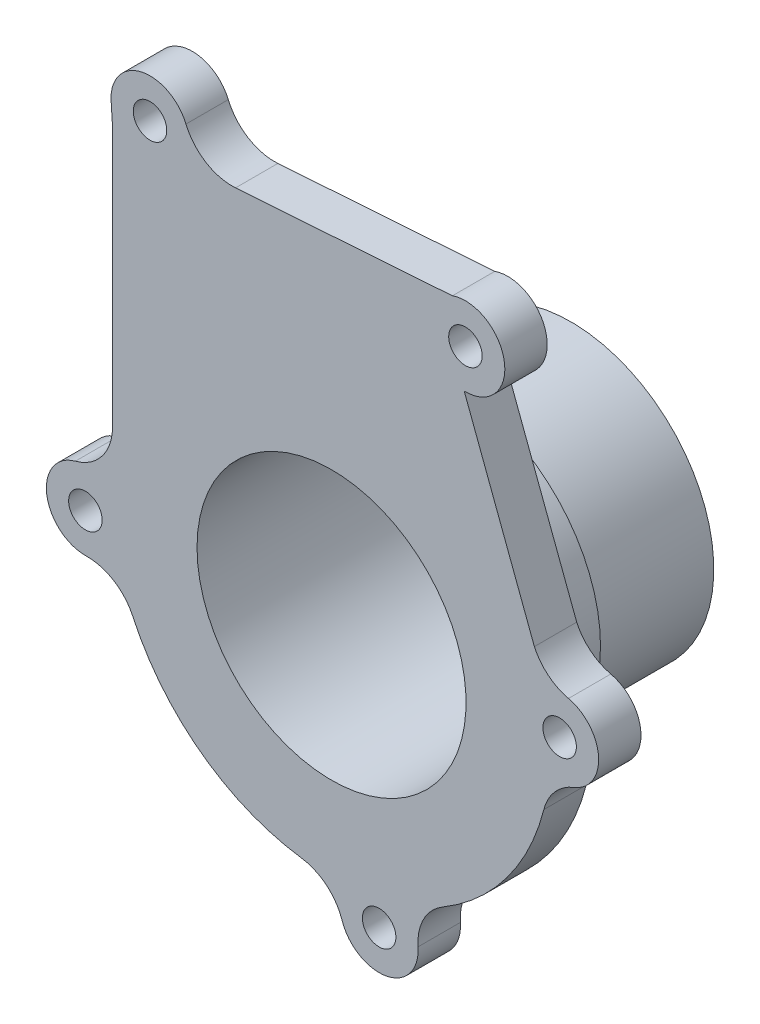
ISO-10303-21;
HEADER;
FILE_DESCRIPTION(('STEP AP214'),'2;1');
FILE_NAME('part.step','',(''),(''),'','','');
FILE_SCHEMA(('AUTOMOTIVE_DESIGN { 1 0 10303 214 1 1 1 1 }'));
ENDSEC;
DATA;
#1=APPLICATION_CONTEXT('core data for automotive mechanical design processes');
#2=APPLICATION_PROTOCOL_DEFINITION('international standard','automotive_design',2000,#1);
#3=PRODUCT_CONTEXT('',#1,'mechanical');
#4=PRODUCT('Part','Part','',(#3));
#5=PRODUCT_RELATED_PRODUCT_CATEGORY('part','',(#4));
#6=PRODUCT_DEFINITION_FORMATION('','',#4);
#7=PRODUCT_DEFINITION_CONTEXT('part definition',#1,'design');
#8=PRODUCT_DEFINITION('design','',#6,#7);
#9=PRODUCT_DEFINITION_SHAPE('','',#8);
#10=(LENGTH_UNIT() NAMED_UNIT(*) SI_UNIT(.MILLI.,.METRE.));
#11=(NAMED_UNIT(*) PLANE_ANGLE_UNIT() SI_UNIT($,.RADIAN.));
#12=(NAMED_UNIT(*) SI_UNIT($,.STERADIAN.) SOLID_ANGLE_UNIT());
#13=UNCERTAINTY_MEASURE_WITH_UNIT(LENGTH_MEASURE(1.E-05),#10,'distance_accuracy_value','');
#14=(GEOMETRIC_REPRESENTATION_CONTEXT(3) GLOBAL_UNCERTAINTY_ASSIGNED_CONTEXT((#13)) GLOBAL_UNIT_ASSIGNED_CONTEXT((#10,
#11,#12)) REPRESENTATION_CONTEXT('',''));
#15=CARTESIAN_POINT('',(0.,0.,0.));
#16=DIRECTION('',(0.,0.,1.));
#17=DIRECTION('',(1.,0.,0.));
#18=AXIS2_PLACEMENT_3D('',#15,#16,#17);
#19=CARTESIAN_POINT('',(52.8528625136495,-60.985277100375,-43.5));
#20=DIRECTION('',(0.,0.,-1.));
#21=DIRECTION('',(-1.,0.,0.));
#22=AXIS2_PLACEMENT_3D('',#19,#20,#21);
#23=PLANE('',#22);
#24=CARTESIAN_POINT('',(-42.3390203978951,65.23,-43.5));
#25=DIRECTION('',(0.,0.,-1.));
#26=DIRECTION('',(-1.,0.,0.));
#27=AXIS2_PLACEMENT_3D('',#24,#25,#26);
#28=CIRCLE('',#27,3.39999999999999);
#29=CARTESIAN_POINT('',(-45.7390203978951,65.23,-43.5));
#30=VERTEX_POINT('',#29);
#31=EDGE_CURVE('E670',#30,#30,#28,.F.);
#32=ORIENTED_EDGE('',*,*,#31,.F.);
#33=EDGE_LOOP('',(#32));
#34=FACE_BOUND('',#33,.T.);
#35=CARTESIAN_POINT('',(4.17391620101742,-53.35,-43.5));
#36=DIRECTION('',(0.,0.,-1.));
#37=DIRECTION('',(-1.,0.,0.));
#38=AXIS2_PLACEMENT_3D('',#35,#36,#37);
#39=CIRCLE('',#38,3.39999999999999);
#40=CARTESIAN_POINT('',(0.773916201017422,-53.35,-43.5));
#41=VERTEX_POINT('',#40);
#42=EDGE_CURVE('E337',#41,#41,#39,.F.);
#43=ORIENTED_EDGE('',*,*,#42,.F.);
#44=EDGE_LOOP('',(#43));
#45=FACE_BOUND('',#44,.T.);
#46=CARTESIAN_POINT('',(-55.4554330708661,-9.83324806785494,-43.5));
#47=DIRECTION('',(0.,0.,-1.));
#48=DIRECTION('',(-1.,0.,0.));
#49=AXIS2_PLACEMENT_3D('',#46,#47,#48);
#50=CIRCLE('',#49,7.92);
#51=CARTESIAN_POINT('',(-57.49,-2.17903763105122,-43.5));
#52=VERTEX_POINT('',#51);
#53=CARTESIAN_POINT('',(-55.28,-17.7513048520442,-43.5));
#54=VERTEX_POINT('',#53);
#55=EDGE_CURVE('E280',#52,#54,#50,.F.);
#56=ORIENTED_EDGE('',*,*,#55,.T.);
#57=CARTESIAN_POINT('',(-55.0547395718603,-27.9182867810235,-43.5));
#58=DIRECTION('',(0.,0.,-1.));
#59=DIRECTION('',(-1.,0.,0.));
#60=AXIS2_PLACEMENT_3D('',#57,#58,#59);
#61=CIRCLE('',#60,10.1694770664315);
#62=CARTESIAN_POINT('',(-45.8263926624487,-23.6455970983729,-43.5));
#63=VERTEX_POINT('',#62);
#64=EDGE_CURVE('E283',#54,#63,#61,.T.);
#65=ORIENTED_EDGE('',*,*,#64,.T.);
#66=CARTESIAN_POINT('',(-5.49,-4.97,-43.5));
#67=DIRECTION('',(0.,0.,-1.));
#68=DIRECTION('',(-1.,0.,0.));
#69=AXIS2_PLACEMENT_3D('',#66,#67,#68);
#70=CIRCLE('',#69,44.45);
#71=CARTESIAN_POINT('',(-11.5860314959817,-49.,-43.5));
#72=VERTEX_POINT('',#71);
#73=EDGE_CURVE('E288',#72,#63,#70,.T.);
#74=ORIENTED_EDGE('',*,*,#73,.F.);
#75=CARTESIAN_POINT('',(-12.9794101236346,-59.064,-43.5));
#76=DIRECTION('',(0.,0.,-1.));
#77=DIRECTION('',(-1.,0.,0.));
#78=AXIS2_PLACEMENT_3D('',#75,#76,#77);
#79=CIRCLE('',#78,10.16);
#80=CARTESIAN_POINT('',(-3.3401515252682,-55.8530353982301,-43.5));
#81=VERTEX_POINT('',#80);
#82=EDGE_CURVE('E367',#72,#81,#79,.T.);
#83=ORIENTED_EDGE('',*,*,#82,.T.);
#84=CARTESIAN_POINT('',(4.17391620101742,-53.35,-43.5));
#85=DIRECTION('',(0.,0.,-1.));
#86=DIRECTION('',(-1.,0.,0.));
#87=AXIS2_PLACEMENT_3D('',#84,#85,#86);
#88=CIRCLE('',#87,7.92);
#89=CARTESIAN_POINT('',(12.0729621051327,-52.774262382088,-43.5));
#90=VERTEX_POINT('',#89);
#91=EDGE_CURVE('E365',#81,#90,#88,.F.);
#92=ORIENTED_EDGE('',*,*,#91,.T.);
#93=CARTESIAN_POINT('',(22.2060815982908,-52.0356898823423,-43.5));
#94=DIRECTION('',(0.,0.,-1.));
#95=DIRECTION('',(-1.,0.,0.));
#96=AXIS2_PLACEMENT_3D('',#93,#94,#95);
#97=CIRCLE('',#96,10.16);
#98=CARTESIAN_POINT('',(17.0533222311669,-43.2792824623716,-43.5));
#99=VERTEX_POINT('',#98);
#100=EDGE_CURVE('E363',#90,#99,#97,.T.);
#101=ORIENTED_EDGE('',*,*,#100,.T.);
#102=CARTESIAN_POINT('',(-5.49,-4.97,-43.5));
#103=DIRECTION('',(0.,0.,-1.));
#104=DIRECTION('',(-1.,0.,0.));
#105=AXIS2_PLACEMENT_3D('',#102,#103,#104);
#106=CIRCLE('',#105,44.45);
#107=CARTESIAN_POINT('',(37.6,-15.8812052496504,-43.5));
#108=VERTEX_POINT('',#107);
#109=EDGE_CURVE('E360',#108,#99,#106,.T.);
#110=ORIENTED_EDGE('',*,*,#109,.F.);
#111=CARTESIAN_POINT('',(47.4491428571429,-18.3751950209991,-43.5));
#112=DIRECTION('',(0.,0.,-1.));
#113=DIRECTION('',(-1.,0.,0.));
#114=AXIS2_PLACEMENT_3D('',#111,#112,#113);
#115=CIRCLE('',#114,10.16);
#116=CARTESIAN_POINT('',(43.7182970922883,-8.92498920954368,-43.5));
#117=VERTEX_POINT('',#116);
#118=EDGE_CURVE('E357',#108,#117,#115,.T.);
#119=ORIENTED_EDGE('',*,*,#118,.T.);
#120=CARTESIAN_POINT('',(40.81,-1.55829334077133,-43.5));
#121=DIRECTION('',(0.,0.,-1.));
#122=DIRECTION('',(-1.,0.,0.));
#123=AXIS2_PLACEMENT_3D('',#120,#121,#122);
#124=CIRCLE('',#123,7.92);
#125=CARTESIAN_POINT('',(42.6070889527177,6.15512816307637,-43.5));
#126=VERTEX_POINT('',#125);
#127=EDGE_CURVE('E175',#117,#126,#124,.F.);
#128=ORIENTED_EDGE('',*,*,#127,.T.);
#129=CARTESIAN_POINT('',(44.9124454880221,16.0501234255881,-43.5));
#130=DIRECTION('',(0.,0.,-1.));
#131=DIRECTION('',(-1.,0.,0.));
#132=AXIS2_PLACEMENT_3D('',#129,#130,#131);
#133=CIRCLE('',#132,10.16);
#134=CARTESIAN_POINT('',(35.68,11.8089502022099,-43.5));
#135=VERTEX_POINT('',#134);
#136=EDGE_CURVE('E176',#126,#135,#133,.T.);
#137=ORIENTED_EDGE('',*,*,#136,.T.);
#138=DIRECTION('',(0.352509857178426,-0.935808100302645,0.));
#139=VECTOR('',#138,1.);
#140=CARTESIAN_POINT('',(35.141844193421,13.2375927004725,-43.5));
#141=LINE('',#140,#139);
#142=CARTESIAN_POINT('',(21.4389175955376,49.6147590321963,-43.5));
#143=VERTEX_POINT('',#142);
#144=EDGE_CURVE('E353',#143,#135,#141,.T.);
#145=ORIENTED_EDGE('',*,*,#144,.F.);
#146=CARTESIAN_POINT('',(21.6878075309389,57.6108864573976,-43.5));
#147=DIRECTION('',(0.,0.,-1.));
#148=DIRECTION('',(-1.,0.,0.));
#149=AXIS2_PLACEMENT_3D('',#146,#147,#148);
#150=CIRCLE('',#149,8.);
#151=CARTESIAN_POINT('',(19.04,65.16,-43.5));
#152=VERTEX_POINT('',#151);
#153=EDGE_CURVE('E350',#152,#143,#150,.T.);
#154=ORIENTED_EDGE('',*,*,#153,.F.);
#155=DIRECTION('',(-0.997623887237485,-0.0688954251976819,0.));
#156=VECTOR('',#155,1.);
#157=CARTESIAN_POINT('',(-4.38818412307743,63.5420608874567,-43.5));
#158=LINE('',#157,#156);
#159=CARTESIAN_POINT('',(-24.98,62.12,-43.5));
#160=VERTEX_POINT('',#159);
#161=EDGE_CURVE('E348',#152,#160,#158,.T.);
#162=ORIENTED_EDGE('',*,*,#161,.T.);
#163=CARTESIAN_POINT('',(-25.6799775200084,72.2558586943328,-43.5));
#164=DIRECTION('',(0.,0.,-1.));
#165=DIRECTION('',(-1.,0.,0.));
#166=AXIS2_PLACEMENT_3D('',#163,#164,#165);
#167=CIRCLE('',#166,10.16);
#168=CARTESIAN_POINT('',(-35.0414750664315,68.3076991625617,-43.5));
#169=VERTEX_POINT('',#168);
#170=EDGE_CURVE('E346',#160,#169,#167,.T.);
#171=ORIENTED_EDGE('',*,*,#170,.T.);
#172=CARTESIAN_POINT('',(-42.3390203978951,65.23,-43.5));
#173=DIRECTION('',(0.,0.,-1.));
#174=DIRECTION('',(-1.,0.,0.));
#175=AXIS2_PLACEMENT_3D('',#172,#173,#174);
#176=CIRCLE('',#175,7.92);
#177=CARTESIAN_POINT('',(-50.2590203978951,65.23,-43.5));
#178=VERTEX_POINT('',#177);
#179=EDGE_CURVE('E344',#169,#178,#176,.F.);
#180=ORIENTED_EDGE('',*,*,#179,.T.);
#181=DIRECTION('',(0.0645749609300092,-0.997912859131942,0.));
#182=VECTOR('',#181,1.);
#183=CARTESIAN_POINT('',(-45.8460108280122,-2.96669627104608,-43.5));
#184=LINE('',#183,#182);
#185=CARTESIAN_POINT('',(-49.94,60.3,-43.5));
#186=VERTEX_POINT('',#185);
#187=EDGE_CURVE('E55',#178,#186,#184,.T.);
#188=ORIENTED_EDGE('',*,*,#187,.T.);
#189=DIRECTION('',(0.,-1.,0.));
#190=VECTOR('',#189,1.);
#191=CARTESIAN_POINT('',(-49.94,0.,-43.5));
#192=LINE('',#191,#190);
#193=CARTESIAN_POINT('',(-49.94,7.63999999999999,-43.5));
#194=VERTEX_POINT('',#193);
#195=EDGE_CURVE('E165',#186,#194,#192,.T.);
#196=ORIENTED_EDGE('',*,*,#195,.T.);
#197=CARTESIAN_POINT('',(-60.1,7.63999999999999,-43.5));
#198=DIRECTION('',(0.,0.,-1.));
#199=DIRECTION('',(-1.,0.,0.));
#200=AXIS2_PLACEMENT_3D('',#197,#198,#199);
#201=CIRCLE('',#200,10.16);
#202=EDGE_CURVE('E167',#194,#52,#201,.T.);
#203=ORIENTED_EDGE('',*,*,#202,.T.);
#204=EDGE_LOOP('',(#56,#65,#74,#83,#92,#101,#110,#119,#128,#137,#145,#154,#162,#171,#180,#188,
#196,#203));
#205=FACE_BOUND('',#204,.T.);
#206=CARTESIAN_POINT('',(-5.49,-4.97,-43.5));
#207=DIRECTION('',(0.,0.,-1.));
#208=DIRECTION('',(-1.,0.,0.));
#209=AXIS2_PLACEMENT_3D('',#206,#207,#208);
#210=CIRCLE('',#209,27.305);
#211=CARTESIAN_POINT('',(-32.795,-4.97,-43.5));
#212=VERTEX_POINT('',#211);
#213=EDGE_CURVE('E171',#212,#212,#210,.F.);
#214=ORIENTED_EDGE('',*,*,#213,.F.);
#215=EDGE_LOOP('',(#214));
#216=FACE_BOUND('',#215,.T.);
#217=CARTESIAN_POINT('',(-55.4554330708661,-9.83324806785494,-43.5));
#218=DIRECTION('',(0.,0.,-1.));
#219=DIRECTION('',(-1.,0.,0.));
#220=AXIS2_PLACEMENT_3D('',#217,#218,#219);
#221=CIRCLE('',#220,3.39999999999999);
#222=CARTESIAN_POINT('',(-58.8554330708661,-9.83324806785494,-43.5));
#223=VERTEX_POINT('',#222);
#224=EDGE_CURVE('E332',#223,#223,#221,.F.);
#225=ORIENTED_EDGE('',*,*,#224,.F.);
#226=EDGE_LOOP('',(#225));
#227=FACE_BOUND('',#226,.T.);
#228=CARTESIAN_POINT('',(40.81,-1.55829334077133,-43.5));
#229=DIRECTION('',(0.,0.,-1.));
#230=DIRECTION('',(-1.,0.,0.));
#231=AXIS2_PLACEMENT_3D('',#228,#229,#230);
#232=CIRCLE('',#231,3.4);
#233=CARTESIAN_POINT('',(37.41,-1.55829334077133,-43.5));
#234=VERTEX_POINT('',#233);
#235=EDGE_CURVE('E321',#234,#234,#232,.F.);
#236=ORIENTED_EDGE('',*,*,#235,.F.);
#237=EDGE_LOOP('',(#236));
#238=FACE_BOUND('',#237,.T.);
#239=CARTESIAN_POINT('',(21.6878075309389,57.6108864573976,-43.5));
#240=DIRECTION('',(0.,0.,-1.));
#241=DIRECTION('',(-1.,0.,0.));
#242=AXIS2_PLACEMENT_3D('',#239,#240,#241);
#243=CIRCLE('',#242,3.39999999999999);
#244=CARTESIAN_POINT('',(18.2878075309389,57.6108864573976,-43.5));
#245=VERTEX_POINT('',#244);
#246=EDGE_CURVE('E322',#245,#245,#243,.F.);
#247=ORIENTED_EDGE('',*,*,#246,.F.);
#248=EDGE_LOOP('',(#247));
#249=FACE_BOUND('',#248,.T.);
#250=ADVANCED_FACE('F40',(#34,#45,#205,#216,#227,#238,#249),#23,.F.);
#251=CARTESIAN_POINT('',(52.8938965863105,-61.5794612709466,-52.0938183168574));
#252=DIRECTION('',(0.,0.,1.));
#253=DIRECTION('',(1.,0.,0.));
#254=AXIS2_PLACEMENT_3D('',#251,#252,#253);
#255=PLANE('',#254);
#256=CARTESIAN_POINT('',(-42.3390203978951,65.23,-52.0938183168574));
#257=DIRECTION('',(0.,0.,-1.));
#258=DIRECTION('',(-1.,0.,0.));
#259=AXIS2_PLACEMENT_3D('',#256,#257,#258);
#260=CIRCLE('',#259,3.39999999999999);
#261=CARTESIAN_POINT('',(-45.7390203978951,65.23,-52.0938183168574));
#262=VERTEX_POINT('',#261);
#263=EDGE_CURVE('E673',#262,#262,#260,.T.);
#264=ORIENTED_EDGE('',*,*,#263,.F.);
#265=EDGE_LOOP('',(#264));
#266=FACE_BOUND('',#265,.T.);
#267=CARTESIAN_POINT('',(21.6878075309389,57.6108864573976,-52.0938183168574));
#268=DIRECTION('',(0.,0.,-1.));
#269=DIRECTION('',(-1.,0.,0.));
#270=AXIS2_PLACEMENT_3D('',#267,#268,#269);
#271=CIRCLE('',#270,3.39999999999999);
#272=CARTESIAN_POINT('',(18.2878075309389,57.6108864573976,-52.0938183168574));
#273=VERTEX_POINT('',#272);
#274=EDGE_CURVE('E328',#273,#273,#271,.T.);
#275=ORIENTED_EDGE('',*,*,#274,.F.);
#276=EDGE_LOOP('',(#275));
#277=FACE_BOUND('',#276,.T.);
#278=CARTESIAN_POINT('',(-55.4554330708661,-9.83324806785494,-52.0938183168574));
#279=DIRECTION('',(0.,0.,-1.));
#280=DIRECTION('',(-1.,0.,0.));
#281=AXIS2_PLACEMENT_3D('',#278,#279,#280);
#282=CIRCLE('',#281,3.39999999999999);
#283=CARTESIAN_POINT('',(-58.8554330708661,-9.83324806785494,-52.0938183168574));
#284=VERTEX_POINT('',#283);
#285=EDGE_CURVE('E325',#284,#284,#282,.T.);
#286=ORIENTED_EDGE('',*,*,#285,.F.);
#287=EDGE_LOOP('',(#286));
#288=FACE_BOUND('',#287,.T.);
#289=CARTESIAN_POINT('',(-60.1,7.63999999999999,-52.0938183168574));
#290=DIRECTION('',(0.,0.,1.));
#291=DIRECTION('',(1.,0.,0.));
#292=AXIS2_PLACEMENT_3D('',#289,#290,#291);
#293=CIRCLE('',#292,10.16);
#294=CARTESIAN_POINT('',(-57.49,-2.17903763105123,-52.0938183168574));
#295=VERTEX_POINT('',#294);
#296=CARTESIAN_POINT('',(-49.94,7.63999999999999,-52.0938183168574));
#297=VERTEX_POINT('',#296);
#298=EDGE_CURVE('E181',#295,#297,#293,.T.);
#299=ORIENTED_EDGE('',*,*,#298,.T.);
#300=DIRECTION('',(0.,1.,0.));
#301=VECTOR('',#300,1.);
#302=CARTESIAN_POINT('',(-49.94,0.,-52.0938183168574));
#303=LINE('',#302,#301);
#304=CARTESIAN_POINT('',(-49.94,60.3,-52.0938183168574));
#305=VERTEX_POINT('',#304);
#306=EDGE_CURVE('E180',#297,#305,#303,.T.);
#307=ORIENTED_EDGE('',*,*,#306,.T.);
#308=DIRECTION('',(-0.0645749609300092,0.997912859131942,0.));
#309=VECTOR('',#308,1.);
#310=CARTESIAN_POINT('',(-45.8460108280122,-2.96669627104608,-52.0938183168574));
#311=LINE('',#310,#309);
#312=CARTESIAN_POINT('',(-50.2590203978951,65.23,-52.0938183168574));
#313=VERTEX_POINT('',#312);
#314=EDGE_CURVE('E224',#305,#313,#311,.T.);
#315=ORIENTED_EDGE('',*,*,#314,.T.);
#316=CARTESIAN_POINT('',(-42.3390203978951,65.23,-52.0938183168574));
#317=DIRECTION('',(0.,0.,1.));
#318=DIRECTION('',(1.,0.,0.));
#319=AXIS2_PLACEMENT_3D('',#316,#317,#318);
#320=CIRCLE('',#319,7.92);
#321=CARTESIAN_POINT('',(-35.0414750664315,68.3076991625617,-52.0938183168574));
#322=VERTEX_POINT('',#321);
#323=EDGE_CURVE('E231',#313,#322,#320,.F.);
#324=ORIENTED_EDGE('',*,*,#323,.T.);
#325=CARTESIAN_POINT('',(-25.6799775200084,72.2558586943328,-52.0938183168574));
#326=DIRECTION('',(0.,0.,1.));
#327=DIRECTION('',(1.,0.,0.));
#328=AXIS2_PLACEMENT_3D('',#325,#326,#327);
#329=CIRCLE('',#328,10.16);
#330=CARTESIAN_POINT('',(-24.98,62.12,-52.0938183168574));
#331=VERTEX_POINT('',#330);
#332=EDGE_CURVE('E233',#322,#331,#329,.T.);
#333=ORIENTED_EDGE('',*,*,#332,.T.);
#334=DIRECTION('',(0.997623887237485,0.0688954251976819,0.));
#335=VECTOR('',#334,1.);
#336=CARTESIAN_POINT('',(-4.38818412307743,63.5420608874567,-52.0938183168574));
#337=LINE('',#336,#335);
#338=CARTESIAN_POINT('',(19.04,65.16,-52.0938183168574));
#339=VERTEX_POINT('',#338);
#340=EDGE_CURVE('E239',#331,#339,#337,.T.);
#341=ORIENTED_EDGE('',*,*,#340,.T.);
#342=CARTESIAN_POINT('',(21.6878075309389,57.6108864573976,-52.0938183168574));
#343=DIRECTION('',(0.,0.,1.));
#344=DIRECTION('',(1.,0.,0.));
#345=AXIS2_PLACEMENT_3D('',#342,#343,#344);
#346=CIRCLE('',#345,8.);
#347=CARTESIAN_POINT('',(21.4389175955376,49.6147590321963,-52.0938183168574));
#348=VERTEX_POINT('',#347);
#349=EDGE_CURVE('E242',#348,#339,#346,.T.);
#350=ORIENTED_EDGE('',*,*,#349,.F.);
#351=DIRECTION('',(-0.352509857178426,0.935808100302645,0.));
#352=VECTOR('',#351,1.);
#353=CARTESIAN_POINT('',(35.141844193421,13.2375927004725,-52.0938183168574));
#354=LINE('',#353,#352);
#355=CARTESIAN_POINT('',(35.68,11.8089502022099,-52.0938183168574));
#356=VERTEX_POINT('',#355);
#357=EDGE_CURVE('E245',#356,#348,#354,.T.);
#358=ORIENTED_EDGE('',*,*,#357,.F.);
#359=CARTESIAN_POINT('',(44.9124454880221,16.0501234255881,-52.0938183168574));
#360=DIRECTION('',(0.,0.,1.));
#361=DIRECTION('',(1.,0.,0.));
#362=AXIS2_PLACEMENT_3D('',#359,#360,#361);
#363=CIRCLE('',#362,10.16);
#364=CARTESIAN_POINT('',(42.6070889527177,6.15512816307637,-52.0938183168574));
#365=VERTEX_POINT('',#364);
#366=EDGE_CURVE('E248',#356,#365,#363,.T.);
#367=ORIENTED_EDGE('',*,*,#366,.T.);
#368=CARTESIAN_POINT('',(40.81,-1.55829334077133,-52.0938183168574));
#369=DIRECTION('',(0.,0.,1.));
#370=DIRECTION('',(1.,0.,0.));
#371=AXIS2_PLACEMENT_3D('',#368,#369,#370);
#372=CIRCLE('',#371,7.92);
#373=CARTESIAN_POINT('',(43.7182970922883,-8.92498920954368,-52.0938183168574));
#374=VERTEX_POINT('',#373);
#375=EDGE_CURVE('E251',#365,#374,#372,.F.);
#376=ORIENTED_EDGE('',*,*,#375,.T.);
#377=CARTESIAN_POINT('',(47.4491428571429,-18.3751950209991,-52.0938183168574));
#378=DIRECTION('',(0.,0.,1.));
#379=DIRECTION('',(1.,0.,0.));
#380=AXIS2_PLACEMENT_3D('',#377,#378,#379);
#381=CIRCLE('',#380,10.16);
#382=CARTESIAN_POINT('',(37.6,-15.8812052496504,-52.0938183168574));
#383=VERTEX_POINT('',#382);
#384=EDGE_CURVE('E254',#374,#383,#381,.T.);
#385=ORIENTED_EDGE('',*,*,#384,.T.);
#386=CARTESIAN_POINT('',(-5.49,-4.97,-52.0938183168574));
#387=DIRECTION('',(0.,0.,1.));
#388=DIRECTION('',(1.,0.,0.));
#389=AXIS2_PLACEMENT_3D('',#386,#387,#388);
#390=CIRCLE('',#389,44.45);
#391=CARTESIAN_POINT('',(17.0533222311669,-43.2792824623716,-52.0938183168574));
#392=VERTEX_POINT('',#391);
#393=EDGE_CURVE('E257',#392,#383,#390,.T.);
#394=ORIENTED_EDGE('',*,*,#393,.F.);
#395=CARTESIAN_POINT('',(22.2060815982908,-52.0356898823423,-52.0938183168574));
#396=DIRECTION('',(0.,0.,1.));
#397=DIRECTION('',(1.,0.,0.));
#398=AXIS2_PLACEMENT_3D('',#395,#396,#397);
#399=CIRCLE('',#398,10.16);
#400=CARTESIAN_POINT('',(12.0729621051327,-52.774262382088,-52.0938183168574));
#401=VERTEX_POINT('',#400);
#402=EDGE_CURVE('E260',#392,#401,#399,.T.);
#403=ORIENTED_EDGE('',*,*,#402,.T.);
#404=CARTESIAN_POINT('',(4.17391620101742,-53.35,-52.0938183168574));
#405=DIRECTION('',(0.,0.,1.));
#406=DIRECTION('',(1.,0.,0.));
#407=AXIS2_PLACEMENT_3D('',#404,#405,#406);
#408=CIRCLE('',#407,7.92);
#409=CARTESIAN_POINT('',(-3.3401515252682,-55.8530353982301,-52.0938183168574));
#410=VERTEX_POINT('',#409);
#411=EDGE_CURVE('E263',#401,#410,#408,.F.);
#412=ORIENTED_EDGE('',*,*,#411,.T.);
#413=CARTESIAN_POINT('',(-12.9794101236346,-59.064,-52.0938183168574));
#414=DIRECTION('',(0.,0.,1.));
#415=DIRECTION('',(1.,0.,0.));
#416=AXIS2_PLACEMENT_3D('',#413,#414,#415);
#417=CIRCLE('',#416,10.16);
#418=CARTESIAN_POINT('',(-11.5860314959817,-49.,-52.0938183168574));
#419=VERTEX_POINT('',#418);
#420=EDGE_CURVE('E266',#410,#419,#417,.T.);
#421=ORIENTED_EDGE('',*,*,#420,.T.);
#422=CARTESIAN_POINT('',(-5.49,-4.97,-52.0938183168574));
#423=DIRECTION('',(0.,0.,1.));
#424=DIRECTION('',(1.,0.,0.));
#425=AXIS2_PLACEMENT_3D('',#422,#423,#424);
#426=CIRCLE('',#425,44.45);
#427=CARTESIAN_POINT('',(-45.8263926624487,-23.6455970983729,-52.0938183168574));
#428=VERTEX_POINT('',#427);
#429=EDGE_CURVE('E269',#428,#419,#426,.T.);
#430=ORIENTED_EDGE('',*,*,#429,.F.);
#431=CARTESIAN_POINT('',(-55.0547395718603,-27.9182867810235,-52.0938183168574));
#432=DIRECTION('',(0.,0.,1.));
#433=DIRECTION('',(1.,0.,0.));
#434=AXIS2_PLACEMENT_3D('',#431,#432,#433);
#435=CIRCLE('',#434,10.1694770664315);
#436=CARTESIAN_POINT('',(-55.28,-17.7513048520442,-52.0938183168574));
#437=VERTEX_POINT('',#436);
#438=EDGE_CURVE('E272',#428,#437,#435,.T.);
#439=ORIENTED_EDGE('',*,*,#438,.T.);
#440=CARTESIAN_POINT('',(-55.4554330708661,-9.83324806785494,-52.0938183168574));
#441=DIRECTION('',(0.,0.,1.));
#442=DIRECTION('',(1.,0.,0.));
#443=AXIS2_PLACEMENT_3D('',#440,#441,#442);
#444=CIRCLE('',#443,7.92);
#445=EDGE_CURVE('E185',#437,#295,#444,.F.);
#446=ORIENTED_EDGE('',*,*,#445,.T.);
#447=EDGE_LOOP('',(#299,#307,#315,#324,#333,#341,#350,#358,#367,#376,#385,#394,#403,#412,#421,
#430,#439,#446));
#448=FACE_BOUND('',#447,.T.);
#449=CARTESIAN_POINT('',(-5.49,-4.97,-52.0938183168574));
#450=DIRECTION('',(0.,0.,1.));
#451=DIRECTION('',(1.,0.,0.));
#452=AXIS2_PLACEMENT_3D('',#449,#450,#451);
#453=CIRCLE('',#452,31.);
#454=CARTESIAN_POINT('',(25.51,-4.97,-52.0938183168574));
#455=VERTEX_POINT('',#454);
#456=EDGE_CURVE('E11',#455,#455,#453,.F.);
#457=ORIENTED_EDGE('',*,*,#456,.F.);
#458=EDGE_LOOP('',(#457));
#459=FACE_BOUND('',#458,.T.);
#460=CARTESIAN_POINT('',(4.17391620101742,-53.35,-52.0938183168574));
#461=DIRECTION('',(0.,0.,-1.));
#462=DIRECTION('',(-1.,0.,0.));
#463=AXIS2_PLACEMENT_3D('',#460,#461,#462);
#464=CIRCLE('',#463,3.39999999999999);
#465=CARTESIAN_POINT('',(0.773916201017426,-53.35,-52.0938183168574));
#466=VERTEX_POINT('',#465);
#467=EDGE_CURVE('E316',#466,#466,#464,.T.);
#468=ORIENTED_EDGE('',*,*,#467,.F.);
#469=EDGE_LOOP('',(#468));
#470=FACE_BOUND('',#469,.T.);
#471=CARTESIAN_POINT('',(40.81,-1.55829334077133,-52.0938183168574));
#472=DIRECTION('',(0.,0.,-1.));
#473=DIRECTION('',(-1.,0.,0.));
#474=AXIS2_PLACEMENT_3D('',#471,#472,#473);
#475=CIRCLE('',#474,3.39999999999999);
#476=CARTESIAN_POINT('',(37.41,-1.55829334077133,-52.0938183168574));
#477=VERTEX_POINT('',#476);
#478=EDGE_CURVE('E319',#477,#477,#475,.T.);
#479=ORIENTED_EDGE('',*,*,#478,.F.);
#480=EDGE_LOOP('',(#479));
#481=FACE_BOUND('',#480,.T.);
#482=ADVANCED_FACE('F221',(#266,#277,#288,#448,#459,#470,#481),#255,.F.);
#483=CARTESIAN_POINT('',(-5.49,-4.97,-67.0938183168574));
#484=DIRECTION('',(0.,0.,-1.));
#485=DIRECTION('',(-1.,0.,0.));
#486=AXIS2_PLACEMENT_3D('',#483,#484,#485);
#487=PLANE('',#486);
#488=CARTESIAN_POINT('',(-5.49,-4.97,-67.0938183168574));
#489=DIRECTION('',(0.,0.,-1.));
#490=DIRECTION('',(-1.,0.,0.));
#491=AXIS2_PLACEMENT_3D('',#488,#489,#490);
#492=CIRCLE('',#491,31.);
#493=CARTESIAN_POINT('',(-36.49,-4.97,-67.0938183168574));
#494=VERTEX_POINT('',#493);
#495=EDGE_CURVE('E227',#494,#494,#492,.T.);
#496=ORIENTED_EDGE('',*,*,#495,.T.);
#497=EDGE_LOOP('',(#496));
#498=FACE_BOUND('',#497,.T.);
#499=CARTESIAN_POINT('',(-5.49,-4.97,-67.0938183168574));
#500=DIRECTION('',(0.,0.,-1.));
#501=DIRECTION('',(-1.,0.,0.));
#502=AXIS2_PLACEMENT_3D('',#499,#500,#501);
#503=CIRCLE('',#502,29.);
#504=CARTESIAN_POINT('',(-34.49,-4.97,-67.0938183168574));
#505=VERTEX_POINT('',#504);
#506=EDGE_CURVE('E286',#505,#505,#503,.T.);
#507=ORIENTED_EDGE('',*,*,#506,.F.);
#508=EDGE_LOOP('',(#507));
#509=FACE_BOUND('',#508,.T.);
#510=ADVANCED_FACE('F299',(#498,#509),#487,.T.);
#511=CARTESIAN_POINT('',(-60.1,7.63999999999999,-30.));
#512=DIRECTION('',(0.,0.,-1.));
#513=DIRECTION('',(1.,0.,0.));
#514=AXIS2_PLACEMENT_3D('',#511,#512,#513);
#515=CYLINDRICAL_SURFACE('',#514,10.16);
#516=ORIENTED_EDGE('',*,*,#202,.F.);
#517=DIRECTION('',(0.,0.,-1.));
#518=VECTOR('',#517,1.);
#519=CARTESIAN_POINT('',(-49.94,7.63999999999999,-30.));
#520=LINE('',#519,#518);
#521=EDGE_CURVE('E63',#194,#297,#520,.T.);
#522=ORIENTED_EDGE('',*,*,#521,.T.);
#523=ORIENTED_EDGE('',*,*,#298,.F.);
#524=DIRECTION('',(0.,0.,-1.));
#525=VECTOR('',#524,1.);
#526=CARTESIAN_POINT('',(-57.49,-2.17903763105122,-30.));
#527=LINE('',#526,#525);
#528=EDGE_CURVE('E174',#52,#295,#527,.T.);
#529=ORIENTED_EDGE('',*,*,#528,.F.);
#530=EDGE_LOOP('',(#516,#522,#523,#529));
#531=FACE_BOUND('',#530,.T.);
#532=ADVANCED_FACE('F173',(#531),#515,.F.);
#533=CARTESIAN_POINT('',(-55.4554330708661,-9.83324806785494,-30.));
#534=DIRECTION('',(0.,0.,-1.));
#535=DIRECTION('',(1.,0.,0.));
#536=AXIS2_PLACEMENT_3D('',#533,#534,#535);
#537=CYLINDRICAL_SURFACE('',#536,7.92);
#538=ORIENTED_EDGE('',*,*,#55,.F.);
#539=ORIENTED_EDGE('',*,*,#528,.T.);
#540=ORIENTED_EDGE('',*,*,#445,.F.);
#541=DIRECTION('',(0.,0.,-1.));
#542=VECTOR('',#541,1.);
#543=CARTESIAN_POINT('',(-55.28,-17.7513048520442,-30.));
#544=LINE('',#543,#542);
#545=EDGE_CURVE('E183',#54,#437,#544,.T.);
#546=ORIENTED_EDGE('',*,*,#545,.F.);
#547=EDGE_LOOP('',(#538,#539,#540,#546));
#548=FACE_BOUND('',#547,.T.);
#549=ADVANCED_FACE('F279',(#548),#537,.T.);
#550=CARTESIAN_POINT('',(-55.0547395718603,-27.9182867810235,-30.));
#551=DIRECTION('',(0.,0.,-1.));
#552=DIRECTION('',(1.,0.,0.));
#553=AXIS2_PLACEMENT_3D('',#550,#551,#552);
#554=CYLINDRICAL_SURFACE('',#553,10.1694770664315);
#555=ORIENTED_EDGE('',*,*,#64,.F.);
#556=ORIENTED_EDGE('',*,*,#545,.T.);
#557=ORIENTED_EDGE('',*,*,#438,.F.);
#558=DIRECTION('',(0.,0.,-1.));
#559=VECTOR('',#558,1.);
#560=CARTESIAN_POINT('',(-45.8263926624487,-23.6455970983729,-30.));
#561=LINE('',#560,#559);
#562=EDGE_CURVE('E190',#63,#428,#561,.T.);
#563=ORIENTED_EDGE('',*,*,#562,.F.);
#564=EDGE_LOOP('',(#555,#556,#557,#563));
#565=FACE_BOUND('',#564,.T.);
#566=ADVANCED_FACE('F375',(#565),#554,.F.);
#567=CARTESIAN_POINT('',(-5.49,-4.97,-30.));
#568=DIRECTION('',(0.,0.,-1.));
#569=DIRECTION('',(1.,0.,0.));
#570=AXIS2_PLACEMENT_3D('',#567,#568,#569);
#571=CYLINDRICAL_SURFACE('',#570,44.45);
#572=DIRECTION('',(0.,0.,-1.));
#573=VECTOR('',#572,1.);
#574=CARTESIAN_POINT('',(-11.5860314959817,-49.,-30.));
#575=LINE('',#574,#573);
#576=EDGE_CURVE('E192',#72,#419,#575,.T.);
#577=ORIENTED_EDGE('',*,*,#576,.F.);
#578=ORIENTED_EDGE('',*,*,#73,.T.);
#579=ORIENTED_EDGE('',*,*,#562,.T.);
#580=ORIENTED_EDGE('',*,*,#429,.T.);
#581=EDGE_LOOP('',(#577,#578,#579,#580));
#582=FACE_BOUND('',#581,.T.);
#583=ADVANCED_FACE('F372',(#582),#571,.T.);
#584=CARTESIAN_POINT('',(-12.9794101236346,-59.064,-30.));
#585=DIRECTION('',(0.,0.,-1.));
#586=DIRECTION('',(1.,0.,0.));
#587=AXIS2_PLACEMENT_3D('',#584,#585,#586);
#588=CYLINDRICAL_SURFACE('',#587,10.16);
#589=ORIENTED_EDGE('',*,*,#82,.F.);
#590=ORIENTED_EDGE('',*,*,#576,.T.);
#591=ORIENTED_EDGE('',*,*,#420,.F.);
#592=DIRECTION('',(0.,0.,-1.));
#593=VECTOR('',#592,1.);
#594=CARTESIAN_POINT('',(-3.3401515252682,-55.8530353982301,-30.));
#595=LINE('',#594,#593);
#596=EDGE_CURVE('E194',#81,#410,#595,.T.);
#597=ORIENTED_EDGE('',*,*,#596,.F.);
#598=EDGE_LOOP('',(#589,#590,#591,#597));
#599=FACE_BOUND('',#598,.T.);
#600=ADVANCED_FACE('F382',(#599),#588,.F.);
#601=CARTESIAN_POINT('',(4.17391620101742,-53.35,-30.));
#602=DIRECTION('',(0.,0.,-1.));
#603=DIRECTION('',(1.,0.,0.));
#604=AXIS2_PLACEMENT_3D('',#601,#602,#603);
#605=CYLINDRICAL_SURFACE('',#604,7.92);
#606=ORIENTED_EDGE('',*,*,#91,.F.);
#607=ORIENTED_EDGE('',*,*,#596,.T.);
#608=ORIENTED_EDGE('',*,*,#411,.F.);
#609=DIRECTION('',(0.,0.,-1.));
#610=VECTOR('',#609,1.);
#611=CARTESIAN_POINT('',(12.0729621051327,-52.774262382088,-30.));
#612=LINE('',#611,#610);
#613=EDGE_CURVE('E196',#90,#401,#612,.T.);
#614=ORIENTED_EDGE('',*,*,#613,.F.);
#615=EDGE_LOOP('',(#606,#607,#608,#614));
#616=FACE_BOUND('',#615,.T.);
#617=ADVANCED_FACE('F437',(#616),#605,.T.);
#618=CARTESIAN_POINT('',(22.2060815982908,-52.0356898823423,-30.));
#619=DIRECTION('',(0.,0.,-1.));
#620=DIRECTION('',(1.,0.,0.));
#621=AXIS2_PLACEMENT_3D('',#618,#619,#620);
#622=CYLINDRICAL_SURFACE('',#621,10.16);
#623=ORIENTED_EDGE('',*,*,#100,.F.);
#624=ORIENTED_EDGE('',*,*,#613,.T.);
#625=ORIENTED_EDGE('',*,*,#402,.F.);
#626=DIRECTION('',(0.,0.,-1.));
#627=VECTOR('',#626,1.);
#628=CARTESIAN_POINT('',(17.0533222311669,-43.2792824623716,-30.));
#629=LINE('',#628,#627);
#630=EDGE_CURVE('E198',#99,#392,#629,.T.);
#631=ORIENTED_EDGE('',*,*,#630,.F.);
#632=EDGE_LOOP('',(#623,#624,#625,#631));
#633=FACE_BOUND('',#632,.T.);
#634=ADVANCED_FACE('F447',(#633),#622,.F.);
#635=CARTESIAN_POINT('',(-5.49,-4.97,-30.));
#636=DIRECTION('',(0.,0.,-1.));
#637=DIRECTION('',(1.,0.,0.));
#638=AXIS2_PLACEMENT_3D('',#635,#636,#637);
#639=CYLINDRICAL_SURFACE('',#638,44.45);
#640=DIRECTION('',(0.,0.,-1.));
#641=VECTOR('',#640,1.);
#642=CARTESIAN_POINT('',(37.6,-15.8812052496504,-30.));
#643=LINE('',#642,#641);
#644=EDGE_CURVE('E200',#108,#383,#643,.T.);
#645=ORIENTED_EDGE('',*,*,#644,.F.);
#646=ORIENTED_EDGE('',*,*,#109,.T.);
#647=ORIENTED_EDGE('',*,*,#630,.T.);
#648=ORIENTED_EDGE('',*,*,#393,.T.);
#649=EDGE_LOOP('',(#645,#646,#647,#648));
#650=FACE_BOUND('',#649,.T.);
#651=ADVANCED_FACE('F457',(#650),#639,.T.);
#652=CARTESIAN_POINT('',(47.4491428571429,-18.3751950209991,-30.));
#653=DIRECTION('',(0.,0.,-1.));
#654=DIRECTION('',(1.,0.,0.));
#655=AXIS2_PLACEMENT_3D('',#652,#653,#654);
#656=CYLINDRICAL_SURFACE('',#655,10.16);
#657=ORIENTED_EDGE('',*,*,#118,.F.);
#658=ORIENTED_EDGE('',*,*,#644,.T.);
#659=ORIENTED_EDGE('',*,*,#384,.F.);
#660=DIRECTION('',(0.,0.,-1.));
#661=VECTOR('',#660,1.);
#662=CARTESIAN_POINT('',(43.7182970922883,-8.92498920954368,-30.));
#663=LINE('',#662,#661);
#664=EDGE_CURVE('E202',#117,#374,#663,.T.);
#665=ORIENTED_EDGE('',*,*,#664,.F.);
#666=EDGE_LOOP('',(#657,#658,#659,#665));
#667=FACE_BOUND('',#666,.T.);
#668=ADVANCED_FACE('F468',(#667),#656,.F.);
#669=CARTESIAN_POINT('',(40.81,-1.55829334077133,-30.));
#670=DIRECTION('',(0.,0.,-1.));
#671=DIRECTION('',(1.,0.,0.));
#672=AXIS2_PLACEMENT_3D('',#669,#670,#671);
#673=CYLINDRICAL_SURFACE('',#672,7.92);
#674=DIRECTION('',(0.,0.,-1.));
#675=VECTOR('',#674,1.);
#676=CARTESIAN_POINT('',(42.6070889527177,6.15512816307637,-30.));
#677=LINE('',#676,#675);
#678=EDGE_CURVE('E204',#126,#365,#677,.T.);
#679=ORIENTED_EDGE('',*,*,#678,.F.);
#680=ORIENTED_EDGE('',*,*,#127,.F.);
#681=ORIENTED_EDGE('',*,*,#664,.T.);
#682=ORIENTED_EDGE('',*,*,#375,.F.);
#683=EDGE_LOOP('',(#679,#680,#681,#682));
#684=FACE_BOUND('',#683,.T.);
#685=ADVANCED_FACE('F478',(#684),#673,.T.);
#686=CARTESIAN_POINT('',(44.9124454880221,16.0501234255881,-30.));
#687=DIRECTION('',(0.,0.,-1.));
#688=DIRECTION('',(1.,0.,0.));
#689=AXIS2_PLACEMENT_3D('',#686,#687,#688);
#690=CYLINDRICAL_SURFACE('',#689,10.16);
#691=ORIENTED_EDGE('',*,*,#136,.F.);
#692=ORIENTED_EDGE('',*,*,#678,.T.);
#693=ORIENTED_EDGE('',*,*,#366,.F.);
#694=DIRECTION('',(0.,0.,-1.));
#695=VECTOR('',#694,1.);
#696=CARTESIAN_POINT('',(35.68,11.8089502022099,-30.));
#697=LINE('',#696,#695);
#698=EDGE_CURVE('E206',#135,#356,#697,.T.);
#699=ORIENTED_EDGE('',*,*,#698,.F.);
#700=EDGE_LOOP('',(#691,#692,#693,#699));
#701=FACE_BOUND('',#700,.T.);
#702=ADVANCED_FACE('F488',(#701),#690,.F.);
#703=CARTESIAN_POINT('',(35.141844193421,13.2375927004725,-30.));
#704=DIRECTION('',(-0.935808100302645,-0.352509857178426,0.));
#705=DIRECTION('',(0.352509857178426,-0.935808100302645,0.));
#706=AXIS2_PLACEMENT_3D('',#703,#704,#705);
#707=PLANE('',#706);
#708=DIRECTION('',(0.,0.,-1.));
#709=VECTOR('',#708,1.);
#710=CARTESIAN_POINT('',(21.4389175955376,49.6147590321963,-30.));
#711=LINE('',#710,#709);
#712=EDGE_CURVE('E208',#143,#348,#711,.T.);
#713=ORIENTED_EDGE('',*,*,#712,.F.);
#714=ORIENTED_EDGE('',*,*,#144,.T.);
#715=ORIENTED_EDGE('',*,*,#698,.T.);
#716=ORIENTED_EDGE('',*,*,#357,.T.);
#717=EDGE_LOOP('',(#713,#714,#715,#716));
#718=FACE_BOUND('',#717,.T.);
#719=ADVANCED_FACE('F498',(#718),#707,.F.);
#720=CARTESIAN_POINT('',(21.6878075309389,57.6108864573976,-30.));
#721=DIRECTION('',(0.,0.,-1.));
#722=DIRECTION('',(1.,0.,0.));
#723=AXIS2_PLACEMENT_3D('',#720,#721,#722);
#724=CYLINDRICAL_SURFACE('',#723,8.);
#725=DIRECTION('',(0.,0.,-1.));
#726=VECTOR('',#725,1.);
#727=CARTESIAN_POINT('',(19.04,65.16,-30.));
#728=LINE('',#727,#726);
#729=EDGE_CURVE('E210',#152,#339,#728,.T.);
#730=ORIENTED_EDGE('',*,*,#729,.F.);
#731=ORIENTED_EDGE('',*,*,#153,.T.);
#732=ORIENTED_EDGE('',*,*,#712,.T.);
#733=ORIENTED_EDGE('',*,*,#349,.T.);
#734=EDGE_LOOP('',(#730,#731,#732,#733));
#735=FACE_BOUND('',#734,.T.);
#736=ADVANCED_FACE('F508',(#735),#724,.T.);
#737=CARTESIAN_POINT('',(-4.38818412307743,63.5420608874567,-30.));
#738=DIRECTION('',(-0.0688954251976819,0.997623887237485,0.));
#739=DIRECTION('',(-0.997623887237485,-0.0688954251976819,0.));
#740=AXIS2_PLACEMENT_3D('',#737,#738,#739);
#741=PLANE('',#740);
#742=ORIENTED_EDGE('',*,*,#161,.F.);
#743=ORIENTED_EDGE('',*,*,#729,.T.);
#744=ORIENTED_EDGE('',*,*,#340,.F.);
#745=DIRECTION('',(0.,0.,-1.));
#746=VECTOR('',#745,1.);
#747=CARTESIAN_POINT('',(-24.98,62.12,-30.));
#748=LINE('',#747,#746);
#749=EDGE_CURVE('E212',#160,#331,#748,.T.);
#750=ORIENTED_EDGE('',*,*,#749,.F.);
#751=EDGE_LOOP('',(#742,#743,#744,#750));
#752=FACE_BOUND('',#751,.T.);
#753=ADVANCED_FACE('F518',(#752),#741,.T.);
#754=CARTESIAN_POINT('',(-25.6799775200084,72.2558586943328,-30.));
#755=DIRECTION('',(0.,0.,-1.));
#756=DIRECTION('',(1.,0.,0.));
#757=AXIS2_PLACEMENT_3D('',#754,#755,#756);
#758=CYLINDRICAL_SURFACE('',#757,10.16);
#759=ORIENTED_EDGE('',*,*,#170,.F.);
#760=ORIENTED_EDGE('',*,*,#749,.T.);
#761=ORIENTED_EDGE('',*,*,#332,.F.);
#762=DIRECTION('',(0.,0.,-1.));
#763=VECTOR('',#762,1.);
#764=CARTESIAN_POINT('',(-35.0414750664315,68.3076991625617,-30.));
#765=LINE('',#764,#763);
#766=EDGE_CURVE('E214',#169,#322,#765,.T.);
#767=ORIENTED_EDGE('',*,*,#766,.F.);
#768=EDGE_LOOP('',(#759,#760,#761,#767));
#769=FACE_BOUND('',#768,.T.);
#770=ADVANCED_FACE('F528',(#769),#758,.F.);
#771=CARTESIAN_POINT('',(-42.3390203978951,65.23,-30.));
#772=DIRECTION('',(0.,0.,-1.));
#773=DIRECTION('',(1.,0.,0.));
#774=AXIS2_PLACEMENT_3D('',#771,#772,#773);
#775=CYLINDRICAL_SURFACE('',#774,7.92);
#776=ORIENTED_EDGE('',*,*,#179,.F.);
#777=ORIENTED_EDGE('',*,*,#766,.T.);
#778=ORIENTED_EDGE('',*,*,#323,.F.);
#779=DIRECTION('',(0.,0.,-1.));
#780=VECTOR('',#779,1.);
#781=CARTESIAN_POINT('',(-50.2590203978951,65.23,-30.));
#782=LINE('',#781,#780);
#783=EDGE_CURVE('E216',#178,#313,#782,.T.);
#784=ORIENTED_EDGE('',*,*,#783,.F.);
#785=EDGE_LOOP('',(#776,#777,#778,#784));
#786=FACE_BOUND('',#785,.T.);
#787=ADVANCED_FACE('F538',(#786),#775,.T.);
#788=CARTESIAN_POINT('',(-45.8460108280122,-2.96669627104608,-30.));
#789=DIRECTION('',(-0.997912859131942,-0.0645749609300092,0.));
#790=DIRECTION('',(0.0645749609300092,-0.997912859131942,0.));
#791=AXIS2_PLACEMENT_3D('',#788,#789,#790);
#792=PLANE('',#791);
#793=ORIENTED_EDGE('',*,*,#187,.F.);
#794=ORIENTED_EDGE('',*,*,#783,.T.);
#795=ORIENTED_EDGE('',*,*,#314,.F.);
#796=DIRECTION('',(0.,0.,-1.));
#797=VECTOR('',#796,1.);
#798=CARTESIAN_POINT('',(-49.94,60.3,-30.));
#799=LINE('',#798,#797);
#800=EDGE_CURVE('E48',#186,#305,#799,.T.);
#801=ORIENTED_EDGE('',*,*,#800,.F.);
#802=EDGE_LOOP('',(#793,#794,#795,#801));
#803=FACE_BOUND('',#802,.T.);
#804=ADVANCED_FACE('F229',(#803),#792,.T.);
#805=CARTESIAN_POINT('',(-49.94,0.,-30.));
#806=DIRECTION('',(-1.,0.,0.));
#807=DIRECTION('',(0.,-1.,0.));
#808=AXIS2_PLACEMENT_3D('',#805,#806,#807);
#809=PLANE('',#808);
#810=ORIENTED_EDGE('',*,*,#195,.F.);
#811=ORIENTED_EDGE('',*,*,#800,.T.);
#812=ORIENTED_EDGE('',*,*,#306,.F.);
#813=ORIENTED_EDGE('',*,*,#521,.F.);
#814=EDGE_LOOP('',(#810,#811,#812,#813));
#815=FACE_BOUND('',#814,.T.);
#816=ADVANCED_FACE('F42',(#815),#809,.T.);
#817=CARTESIAN_POINT('',(-5.49,-4.97,-41.43));
#818=DIRECTION('',(0.,0.,1.));
#819=DIRECTION('',(-1.,0.,0.));
#820=AXIS2_PLACEMENT_3D('',#817,#818,#819);
#821=CYLINDRICAL_SURFACE('',#820,27.305);
#822=ORIENTED_EDGE('',*,*,#213,.T.);
#823=EDGE_LOOP('',(#822));
#824=FACE_BOUND('',#823,.T.);
#825=CARTESIAN_POINT('',(-5.49,-4.97,-92.0938183168574));
#826=DIRECTION('',(0.,0.,-1.));
#827=DIRECTION('',(-1.,0.,0.));
#828=AXIS2_PLACEMENT_3D('',#825,#826,#827);
#829=CIRCLE('',#828,27.305);
#830=CARTESIAN_POINT('',(-32.795,-4.97,-92.0938183168574));
#831=VERTEX_POINT('',#830);
#832=EDGE_CURVE('E282',#831,#831,#829,.T.);
#833=ORIENTED_EDGE('',*,*,#832,.T.);
#834=EDGE_LOOP('',(#833));
#835=FACE_BOUND('',#834,.T.);
#836=ADVANCED_FACE('F306',(#824,#835),#821,.F.);
#837=CARTESIAN_POINT('',(-5.49,-4.97,-67.0938183168574));
#838=DIRECTION('',(0.,0.,1.));
#839=DIRECTION('',(1.,0.,0.));
#840=AXIS2_PLACEMENT_3D('',#837,#838,#839);
#841=CYLINDRICAL_SURFACE('',#840,31.);
#842=ORIENTED_EDGE('',*,*,#495,.F.);
#843=EDGE_LOOP('',(#842));
#844=FACE_BOUND('',#843,.T.);
#845=ORIENTED_EDGE('',*,*,#456,.T.);
#846=EDGE_LOOP('',(#845));
#847=FACE_BOUND('',#846,.T.);
#848=ADVANCED_FACE('F302',(#844,#847),#841,.T.);
#849=CARTESIAN_POINT('',(-5.49,-4.97,-92.0938183168574));
#850=DIRECTION('',(0.,0.,-1.));
#851=DIRECTION('',(-1.,0.,0.));
#852=AXIS2_PLACEMENT_3D('',#849,#850,#851);
#853=PLANE('',#852);
#854=CARTESIAN_POINT('',(-5.49,-4.97,-92.0938183168574));
#855=DIRECTION('',(0.,0.,-1.));
#856=DIRECTION('',(-1.,0.,0.));
#857=AXIS2_PLACEMENT_3D('',#854,#855,#856);
#858=CIRCLE('',#857,29.);
#859=CARTESIAN_POINT('',(-34.49,-4.97,-92.0938183168574));
#860=VERTEX_POINT('',#859);
#861=EDGE_CURVE('E292',#860,#860,#858,.T.);
#862=ORIENTED_EDGE('',*,*,#861,.T.);
#863=EDGE_LOOP('',(#862));
#864=FACE_BOUND('',#863,.T.);
#865=ORIENTED_EDGE('',*,*,#832,.F.);
#866=EDGE_LOOP('',(#865));
#867=FACE_BOUND('',#866,.T.);
#868=ADVANCED_FACE('F305',(#864,#867),#853,.T.);
#869=CARTESIAN_POINT('',(-5.49,-4.97,-92.0938183168574));
#870=DIRECTION('',(0.,0.,1.));
#871=DIRECTION('',(1.,0.,0.));
#872=AXIS2_PLACEMENT_3D('',#869,#870,#871);
#873=CYLINDRICAL_SURFACE('',#872,29.);
#874=ORIENTED_EDGE('',*,*,#861,.F.);
#875=EDGE_LOOP('',(#874));
#876=FACE_BOUND('',#875,.T.);
#877=ORIENTED_EDGE('',*,*,#506,.T.);
#878=EDGE_LOOP('',(#877));
#879=FACE_BOUND('',#878,.T.);
#880=ADVANCED_FACE('F398',(#876,#879),#873,.T.);
#881=CARTESIAN_POINT('',(4.17391620101742,-53.35,-52.0938183168574));
#882=DIRECTION('',(0.,0.,-1.));
#883=DIRECTION('',(-1.,0.,0.));
#884=AXIS2_PLACEMENT_3D('',#881,#882,#883);
#885=CYLINDRICAL_SURFACE('',#884,3.39999999999999);
#886=ORIENTED_EDGE('',*,*,#42,.T.);
#887=EDGE_LOOP('',(#886));
#888=FACE_BOUND('',#887,.T.);
#889=ORIENTED_EDGE('',*,*,#467,.T.);
#890=EDGE_LOOP('',(#889));
#891=FACE_BOUND('',#890,.T.);
#892=ADVANCED_FACE('F394',(#888,#891),#885,.F.);
#893=CARTESIAN_POINT('',(-55.4554330708661,-9.83324806785494,-52.0938183168574));
#894=DIRECTION('',(0.,0.,-1.));
#895=DIRECTION('',(-1.,0.,0.));
#896=AXIS2_PLACEMENT_3D('',#893,#894,#895);
#897=CYLINDRICAL_SURFACE('',#896,3.39999999999999);
#898=ORIENTED_EDGE('',*,*,#224,.T.);
#899=EDGE_LOOP('',(#898));
#900=FACE_BOUND('',#899,.T.);
#901=ORIENTED_EDGE('',*,*,#285,.T.);
#902=EDGE_LOOP('',(#901));
#903=FACE_BOUND('',#902,.T.);
#904=ADVANCED_FACE('F581',(#900,#903),#897,.F.);
#905=CARTESIAN_POINT('',(40.81,-1.55829334077133,-52.0938183168574));
#906=DIRECTION('',(0.,0.,-1.));
#907=DIRECTION('',(-1.,0.,0.));
#908=AXIS2_PLACEMENT_3D('',#905,#906,#907);
#909=CYLINDRICAL_SURFACE('',#908,3.4);
#910=ORIENTED_EDGE('',*,*,#235,.T.);
#911=EDGE_LOOP('',(#910));
#912=FACE_BOUND('',#911,.T.);
#913=ORIENTED_EDGE('',*,*,#478,.T.);
#914=EDGE_LOOP('',(#913));
#915=FACE_BOUND('',#914,.T.);
#916=ADVANCED_FACE('F591',(#912,#915),#909,.F.);
#917=CARTESIAN_POINT('',(21.6878075309389,57.6108864573976,-52.0938183168574));
#918=DIRECTION('',(0.,0.,-1.));
#919=DIRECTION('',(-1.,0.,0.));
#920=AXIS2_PLACEMENT_3D('',#917,#918,#919);
#921=CYLINDRICAL_SURFACE('',#920,3.39999999999999);
#922=ORIENTED_EDGE('',*,*,#246,.T.);
#923=EDGE_LOOP('',(#922));
#924=FACE_BOUND('',#923,.T.);
#925=ORIENTED_EDGE('',*,*,#274,.T.);
#926=EDGE_LOOP('',(#925));
#927=FACE_BOUND('',#926,.T.);
#928=ADVANCED_FACE('F600',(#924,#927),#921,.F.);
#929=CARTESIAN_POINT('',(-42.3390203978951,65.23,-52.0938183168574));
#930=DIRECTION('',(0.,0.,-1.));
#931=DIRECTION('',(-1.,0.,0.));
#932=AXIS2_PLACEMENT_3D('',#929,#930,#931);
#933=CYLINDRICAL_SURFACE('',#932,3.39999999999999);
#934=ORIENTED_EDGE('',*,*,#31,.T.);
#935=EDGE_LOOP('',(#934));
#936=FACE_BOUND('',#935,.T.);
#937=ORIENTED_EDGE('',*,*,#263,.T.);
#938=EDGE_LOOP('',(#937));
#939=FACE_BOUND('',#938,.T.);
#940=ADVANCED_FACE('F610',(#936,#939),#933,.F.);
#941=CLOSED_SHELL('',(#250,#482,#510,#532,#549,#566,#583,#600,#617,#634,#651,#668,#685,#702,
#719,#736,#753,#770,#787,#804,#816,#836,#848,#868,#880,#892,#904,#916,#928,#940));
#942=MANIFOLD_SOLID_BREP('B2',#941);
#943=ADVANCED_BREP_SHAPE_REPRESENTATION('',(#18,#942),#14);
#944=SHAPE_DEFINITION_REPRESENTATION(#9,#943);
ENDSEC;
END-ISO-10303-21;
